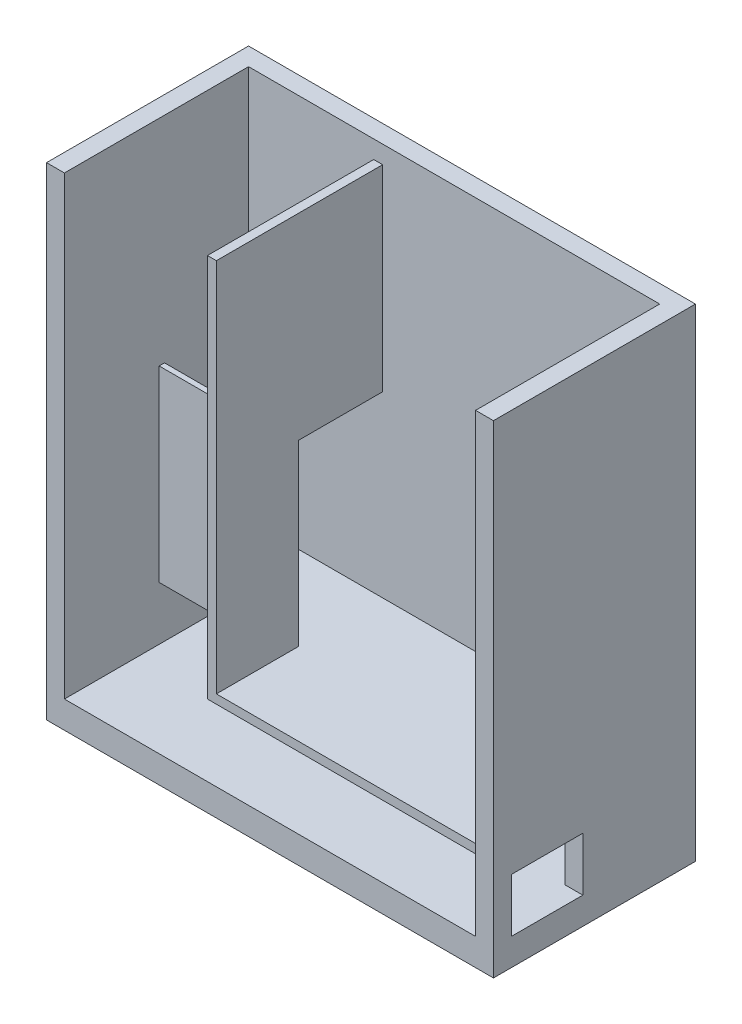
ISO-10303-21;
HEADER;
FILE_DESCRIPTION(('STEP AP214'),'2;1');
FILE_NAME('part.step','',(''),(''),'','','');
FILE_SCHEMA(('AUTOMOTIVE_DESIGN { 1 0 10303 214 1 1 1 1 }'));
ENDSEC;
DATA;
#1=APPLICATION_CONTEXT('core data for automotive mechanical design processes');
#2=APPLICATION_PROTOCOL_DEFINITION('international standard','automotive_design',2000,#1);
#3=PRODUCT_CONTEXT('',#1,'mechanical');
#4=PRODUCT('Part','Part','',(#3));
#5=PRODUCT_RELATED_PRODUCT_CATEGORY('part','',(#4));
#6=PRODUCT_DEFINITION_FORMATION('','',#4);
#7=PRODUCT_DEFINITION_CONTEXT('part definition',#1,'design');
#8=PRODUCT_DEFINITION('design','',#6,#7);
#9=PRODUCT_DEFINITION_SHAPE('','',#8);
#10=(LENGTH_UNIT() NAMED_UNIT(*) SI_UNIT(.MILLI.,.METRE.));
#11=(NAMED_UNIT(*) PLANE_ANGLE_UNIT() SI_UNIT($,.RADIAN.));
#12=(NAMED_UNIT(*) SI_UNIT($,.STERADIAN.) SOLID_ANGLE_UNIT());
#13=UNCERTAINTY_MEASURE_WITH_UNIT(LENGTH_MEASURE(1.E-05),#10,'distance_accuracy_value','');
#14=(GEOMETRIC_REPRESENTATION_CONTEXT(3) GLOBAL_UNCERTAINTY_ASSIGNED_CONTEXT((#13)) GLOBAL_UNIT_ASSIGNED_CONTEXT((#10,
#11,#12)) REPRESENTATION_CONTEXT('',''));
#15=CARTESIAN_POINT('',(0.,0.,0.));
#16=DIRECTION('',(0.,0.,1.));
#17=DIRECTION('',(1.,0.,0.));
#18=AXIS2_PLACEMENT_3D('',#15,#16,#17);
#19=CARTESIAN_POINT('',(120.,135.,56.5));
#20=DIRECTION('',(1.,0.,0.));
#21=DIRECTION('',(0.,1.,0.));
#22=AXIS2_PLACEMENT_3D('',#19,#20,#21);
#23=PLANE('',#22);
#24=DIRECTION('',(0.,0.,-1.));
#25=VECTOR('',#24,1.);
#26=CARTESIAN_POINT('',(120.,7.56999999999999,56.5));
#27=LINE('',#26,#25);
#28=CARTESIAN_POINT('',(120.,7.56999999999999,31.5));
#29=VERTEX_POINT('',#28);
#30=CARTESIAN_POINT('',(120.,7.56999999999999,5.));
#31=VERTEX_POINT('',#30);
#32=EDGE_CURVE('E364',#29,#31,#27,.T.);
#33=ORIENTED_EDGE('',*,*,#32,.F.);
#34=DIRECTION('',(0.,1.,0.));
#35=VECTOR('',#34,1.);
#36=CARTESIAN_POINT('',(120.,135.,31.5));
#37=LINE('',#36,#35);
#38=CARTESIAN_POINT('',(120.,22.57,31.5));
#39=VERTEX_POINT('',#38);
#40=EDGE_CURVE('E235',#29,#39,#37,.T.);
#41=ORIENTED_EDGE('',*,*,#40,.T.);
#42=DIRECTION('',(0.,0.,-1.));
#43=VECTOR('',#42,1.);
#44=CARTESIAN_POINT('',(120.,22.57,30.));
#45=LINE('',#44,#43);
#46=CARTESIAN_POINT('',(120.,22.57,5.));
#47=VERTEX_POINT('',#46);
#48=EDGE_CURVE('E316',#39,#47,#45,.T.);
#49=ORIENTED_EDGE('',*,*,#48,.T.);
#50=DIRECTION('',(0.,-1.,0.));
#51=VECTOR('',#50,1.);
#52=CARTESIAN_POINT('',(120.,135.,5.));
#53=LINE('',#52,#51);
#54=EDGE_CURVE('E363',#47,#31,#53,.T.);
#55=ORIENTED_EDGE('',*,*,#54,.T.);
#56=EDGE_LOOP('',(#33,#41,#49,#55));
#57=FACE_BOUND('',#56,.T.);
#58=ADVANCED_FACE('F40',(#57),#23,.F.);
#59=CARTESIAN_POINT('',(40.,130.,51.5));
#60=DIRECTION('',(0.,-1.,0.));
#61=DIRECTION('',(0.,0.,-1.));
#62=AXIS2_PLACEMENT_3D('',#59,#60,#61);
#63=PLANE('',#62);
#64=DIRECTION('',(-1.,0.,0.));
#65=VECTOR('',#64,1.);
#66=CARTESIAN_POINT('',(40.,130.,51.5));
#67=LINE('',#66,#65);
#68=CARTESIAN_POINT('',(42.5,130.,51.5));
#69=VERTEX_POINT('',#68);
#70=CARTESIAN_POINT('',(40.,130.,51.5));
#71=VERTEX_POINT('',#70);
#72=EDGE_CURVE('E253',#69,#71,#67,.T.);
#73=ORIENTED_EDGE('',*,*,#72,.F.);
#74=DIRECTION('',(0.,0.,-1.));
#75=VECTOR('',#74,1.);
#76=CARTESIAN_POINT('',(42.5,130.,51.5));
#77=LINE('',#76,#75);
#78=CARTESIAN_POINT('',(42.5,130.,5.));
#79=VERTEX_POINT('',#78);
#80=EDGE_CURVE('E341',#69,#79,#77,.T.);
#81=ORIENTED_EDGE('',*,*,#80,.T.);
#82=DIRECTION('',(-1.,0.,0.));
#83=VECTOR('',#82,1.);
#84=CARTESIAN_POINT('',(40.,130.,5.));
#85=LINE('',#84,#83);
#86=CARTESIAN_POINT('',(40.,130.,5.));
#87=VERTEX_POINT('',#86);
#88=EDGE_CURVE('E334',#79,#87,#85,.T.);
#89=ORIENTED_EDGE('',*,*,#88,.T.);
#90=DIRECTION('',(0.,0.,-1.));
#91=VECTOR('',#90,1.);
#92=CARTESIAN_POINT('',(40.,130.,51.5));
#93=LINE('',#92,#91);
#94=EDGE_CURVE('E338',#71,#87,#93,.T.);
#95=ORIENTED_EDGE('',*,*,#94,.F.);
#96=EDGE_LOOP('',(#73,#81,#89,#95));
#97=FACE_BOUND('',#96,.T.);
#98=ADVANCED_FACE('F506',(#97),#63,.F.);
#99=CARTESIAN_POINT('',(5.00000000000002,25.07,30.));
#100=DIRECTION('',(0.,-1.,0.));
#101=DIRECTION('',(0.,0.,-1.));
#102=AXIS2_PLACEMENT_3D('',#99,#100,#101);
#103=PLANE('',#102);
#104=DIRECTION('',(-1.,0.,0.));
#105=VECTOR('',#104,1.);
#106=CARTESIAN_POINT('',(5.00000000000001,25.07,51.5));
#107=LINE('',#106,#105);
#108=CARTESIAN_POINT('',(120.,25.07,51.5));
#109=VERTEX_POINT('',#108);
#110=CARTESIAN_POINT('',(42.5,25.07,51.5));
#111=VERTEX_POINT('',#110);
#112=EDGE_CURVE('E250',#109,#111,#107,.T.);
#113=ORIENTED_EDGE('',*,*,#112,.F.);
#114=DIRECTION('',(0.,0.,-1.));
#115=VECTOR('',#114,1.);
#116=CARTESIAN_POINT('',(120.,25.07,30.));
#117=LINE('',#116,#115);
#118=CARTESIAN_POINT('',(120.,25.07,5.));
#119=VERTEX_POINT('',#118);
#120=EDGE_CURVE('E313',#109,#119,#117,.T.);
#121=ORIENTED_EDGE('',*,*,#120,.T.);
#122=DIRECTION('',(-1.,0.,0.));
#123=VECTOR('',#122,1.);
#124=CARTESIAN_POINT('',(5.00000000000002,25.07,5.));
#125=LINE('',#124,#123);
#126=CARTESIAN_POINT('',(5.00000000000002,25.07,5.));
#127=VERTEX_POINT('',#126);
#128=EDGE_CURVE('E300',#119,#127,#125,.T.);
#129=ORIENTED_EDGE('',*,*,#128,.T.);
#130=DIRECTION('',(0.,0.,-1.));
#131=VECTOR('',#130,1.);
#132=CARTESIAN_POINT('',(5.00000000000002,25.07,30.));
#133=LINE('',#132,#131);
#134=CARTESIAN_POINT('',(5.00000000000002,25.07,28.5));
#135=VERTEX_POINT('',#134);
#136=EDGE_CURVE('E304',#135,#127,#133,.T.);
#137=ORIENTED_EDGE('',*,*,#136,.F.);
#138=DIRECTION('',(1.,0.,0.));
#139=VECTOR('',#138,1.);
#140=CARTESIAN_POINT('',(5.00000000000002,25.07,28.5));
#141=LINE('',#140,#139);
#142=CARTESIAN_POINT('',(42.5,25.07,28.5));
#143=VERTEX_POINT('',#142);
#144=EDGE_CURVE('E284',#135,#143,#141,.T.);
#145=ORIENTED_EDGE('',*,*,#144,.T.);
#146=DIRECTION('',(0.,0.,-1.));
#147=VECTOR('',#146,1.);
#148=CARTESIAN_POINT('',(42.5,25.07,56.5));
#149=LINE('',#148,#147);
#150=EDGE_CURVE('E270',#111,#143,#149,.T.);
#151=ORIENTED_EDGE('',*,*,#150,.F.);
#152=EDGE_LOOP('',(#113,#121,#129,#137,#145,#151));
#153=FACE_BOUND('',#152,.T.);
#154=ADVANCED_FACE('F493',(#153),#103,.F.);
#155=CARTESIAN_POINT('',(0.,0.,56.5));
#156=DIRECTION('',(0.,0.,1.));
#157=DIRECTION('',(1.,0.,0.));
#158=AXIS2_PLACEMENT_3D('',#155,#156,#157);
#159=PLANE('',#158);
#160=DIRECTION('',(0.,-1.,0.));
#161=VECTOR('',#160,1.);
#162=CARTESIAN_POINT('',(120.,135.,56.5));
#163=LINE('',#162,#161);
#164=CARTESIAN_POINT('',(120.,135.,56.5));
#165=VERTEX_POINT('',#164);
#166=CARTESIAN_POINT('',(120.,7.56999999999999,56.5));
#167=VERTEX_POINT('',#166);
#168=EDGE_CURVE('E376',#165,#167,#163,.T.);
#169=ORIENTED_EDGE('',*,*,#168,.T.);
#170=DIRECTION('',(1.,0.,0.));
#171=VECTOR('',#170,1.);
#172=CARTESIAN_POINT('',(5.00000000000002,7.57,56.5));
#173=LINE('',#172,#171);
#174=CARTESIAN_POINT('',(5.00000000000002,7.57,56.5));
#175=VERTEX_POINT('',#174);
#176=EDGE_CURVE('E351',#175,#167,#173,.T.);
#177=ORIENTED_EDGE('',*,*,#176,.F.);
#178=DIRECTION('',(0.,1.,0.));
#179=VECTOR('',#178,1.);
#180=CARTESIAN_POINT('',(5.,135.,56.5));
#181=LINE('',#180,#179);
#182=CARTESIAN_POINT('',(5.,135.,56.5));
#183=VERTEX_POINT('',#182);
#184=EDGE_CURVE('E394',#175,#183,#181,.T.);
#185=ORIENTED_EDGE('',*,*,#184,.T.);
#186=DIRECTION('',(-1.,0.,0.));
#187=VECTOR('',#186,1.);
#188=CARTESIAN_POINT('',(0.,135.,56.5));
#189=LINE('',#188,#187);
#190=CARTESIAN_POINT('',(0.,135.,56.5));
#191=VERTEX_POINT('',#190);
#192=EDGE_CURVE('E397',#183,#191,#189,.T.);
#193=ORIENTED_EDGE('',*,*,#192,.T.);
#194=DIRECTION('',(0.,-1.,0.));
#195=VECTOR('',#194,1.);
#196=CARTESIAN_POINT('',(0.,135.,56.5));
#197=LINE('',#196,#195);
#198=CARTESIAN_POINT('',(0.,0.,56.5));
#199=VERTEX_POINT('',#198);
#200=EDGE_CURVE('E386',#191,#199,#197,.T.);
#201=ORIENTED_EDGE('',*,*,#200,.T.);
#202=DIRECTION('',(1.,0.,0.));
#203=VECTOR('',#202,1.);
#204=CARTESIAN_POINT('',(0.,0.,56.5));
#205=LINE('',#204,#203);
#206=CARTESIAN_POINT('',(125.,0.,56.5));
#207=VERTEX_POINT('',#206);
#208=EDGE_CURVE('E390',#199,#207,#205,.T.);
#209=ORIENTED_EDGE('',*,*,#208,.T.);
#210=DIRECTION('',(0.,1.,0.));
#211=VECTOR('',#210,1.);
#212=CARTESIAN_POINT('',(125.,135.,56.5));
#213=LINE('',#212,#211);
#214=CARTESIAN_POINT('',(125.,135.,56.5));
#215=VERTEX_POINT('',#214);
#216=EDGE_CURVE('E368',#207,#215,#213,.T.);
#217=ORIENTED_EDGE('',*,*,#216,.T.);
#218=DIRECTION('',(-1.,0.,0.));
#219=VECTOR('',#218,1.);
#220=CARTESIAN_POINT('',(125.,135.,56.5));
#221=LINE('',#220,#219);
#222=EDGE_CURVE('E372',#215,#165,#221,.T.);
#223=ORIENTED_EDGE('',*,*,#222,.T.);
#224=EDGE_LOOP('',(#169,#177,#185,#193,#201,#209,#217,#223));
#225=FACE_BOUND('',#224,.T.);
#226=ADVANCED_FACE('F451',(#225),#159,.T.);
#227=CARTESIAN_POINT('',(40.,130.,51.5));
#228=DIRECTION('',(1.,0.,0.));
#229=DIRECTION('',(0.,0.,-1.));
#230=AXIS2_PLACEMENT_3D('',#227,#228,#229);
#231=PLANE('',#230);
#232=DIRECTION('',(0.,-1.,0.));
#233=VECTOR('',#232,1.);
#234=CARTESIAN_POINT('',(40.,135.,51.5));
#235=LINE('',#234,#233);
#236=CARTESIAN_POINT('',(40.,22.57,51.5));
#237=VERTEX_POINT('',#236);
#238=EDGE_CURVE('E241',#71,#237,#235,.T.);
#239=ORIENTED_EDGE('',*,*,#238,.F.);
#240=ORIENTED_EDGE('',*,*,#94,.T.);
#241=DIRECTION('',(0.,-1.,0.));
#242=VECTOR('',#241,1.);
#243=CARTESIAN_POINT('',(40.,130.,5.));
#244=LINE('',#243,#242);
#245=CARTESIAN_POINT('',(40.,75.,5.));
#246=VERTEX_POINT('',#245);
#247=EDGE_CURVE('E322',#87,#246,#244,.T.);
#248=ORIENTED_EDGE('',*,*,#247,.T.);
#249=DIRECTION('',(0.,0.,-1.));
#250=VECTOR('',#249,1.);
#251=CARTESIAN_POINT('',(40.,75.,51.5));
#252=LINE('',#251,#250);
#253=CARTESIAN_POINT('',(40.,75.,28.5));
#254=VERTEX_POINT('',#253);
#255=EDGE_CURVE('E347',#254,#246,#252,.T.);
#256=ORIENTED_EDGE('',*,*,#255,.F.);
#257=DIRECTION('',(0.,0.,1.));
#258=VECTOR('',#257,1.);
#259=CARTESIAN_POINT('',(40.,75.,-0.001000000000001));
#260=LINE('',#259,#258);
#261=CARTESIAN_POINT('',(40.,75.,30.));
#262=VERTEX_POINT('',#261);
#263=EDGE_CURVE('E261',#254,#262,#260,.T.);
#264=ORIENTED_EDGE('',*,*,#263,.T.);
#265=DIRECTION('',(0.,-1.,0.));
#266=VECTOR('',#265,1.);
#267=CARTESIAN_POINT('',(40.,165.032128111207,30.));
#268=LINE('',#267,#266);
#269=CARTESIAN_POINT('',(40.,22.57,30.));
#270=VERTEX_POINT('',#269);
#271=EDGE_CURVE('E291',#262,#270,#268,.T.);
#272=ORIENTED_EDGE('',*,*,#271,.T.);
#273=DIRECTION('',(0.,0.,-1.));
#274=VECTOR('',#273,1.);
#275=CARTESIAN_POINT('',(40.,22.57,136.539052967911));
#276=LINE('',#275,#274);
#277=EDGE_CURVE('E281',#237,#270,#276,.T.);
#278=ORIENTED_EDGE('',*,*,#277,.F.);
#279=EDGE_LOOP('',(#239,#240,#248,#256,#264,#272,#278));
#280=FACE_BOUND('',#279,.T.);
#281=ADVANCED_FACE('F512',(#280),#231,.F.);
#282=CARTESIAN_POINT('',(42.5,130.,51.5));
#283=DIRECTION('',(-1.,0.,0.));
#284=DIRECTION('',(0.,-1.,0.));
#285=AXIS2_PLACEMENT_3D('',#282,#283,#284);
#286=PLANE('',#285);
#287=DIRECTION('',(0.,1.,0.));
#288=VECTOR('',#287,1.);
#289=CARTESIAN_POINT('',(42.5,130.,51.5));
#290=LINE('',#289,#288);
#291=EDGE_CURVE('E247',#111,#69,#290,.T.);
#292=ORIENTED_EDGE('',*,*,#291,.F.);
#293=ORIENTED_EDGE('',*,*,#150,.T.);
#294=DIRECTION('',(0.,-1.,0.));
#295=VECTOR('',#294,1.);
#296=CARTESIAN_POINT('',(42.5,158.111385593741,28.5));
#297=LINE('',#296,#295);
#298=CARTESIAN_POINT('',(42.5,75.,28.5));
#299=VERTEX_POINT('',#298);
#300=EDGE_CURVE('E273',#299,#143,#297,.T.);
#301=ORIENTED_EDGE('',*,*,#300,.F.);
#302=DIRECTION('',(0.,0.,-1.));
#303=VECTOR('',#302,1.);
#304=CARTESIAN_POINT('',(42.5,75.,51.5));
#305=LINE('',#304,#303);
#306=CARTESIAN_POINT('',(42.5,75.,5.));
#307=VERTEX_POINT('',#306);
#308=EDGE_CURVE('E344',#299,#307,#305,.T.);
#309=ORIENTED_EDGE('',*,*,#308,.T.);
#310=DIRECTION('',(0.,1.,0.));
#311=VECTOR('',#310,1.);
#312=CARTESIAN_POINT('',(42.5,130.,5.));
#313=LINE('',#312,#311);
#314=EDGE_CURVE('E330',#307,#79,#313,.T.);
#315=ORIENTED_EDGE('',*,*,#314,.T.);
#316=ORIENTED_EDGE('',*,*,#80,.F.);
#317=EDGE_LOOP('',(#292,#293,#301,#309,#315,#316));
#318=FACE_BOUND('',#317,.T.);
#319=ADVANCED_FACE('F501',(#318),#286,.F.);
#320=CARTESIAN_POINT('',(5.00000000000002,22.57,30.));
#321=DIRECTION('',(0.,1.,0.));
#322=DIRECTION('',(-1.,0.,0.));
#323=AXIS2_PLACEMENT_3D('',#320,#321,#322);
#324=PLANE('',#323);
#325=ORIENTED_EDGE('',*,*,#48,.F.);
#326=DIRECTION('',(1.,0.,0.));
#327=VECTOR('',#326,1.);
#328=CARTESIAN_POINT('',(117.5,22.57,31.5));
#329=LINE('',#328,#327);
#330=CARTESIAN_POINT('',(125.,22.57,31.5));
#331=VERTEX_POINT('',#330);
#332=EDGE_CURVE('E207',#39,#331,#329,.T.);
#333=ORIENTED_EDGE('',*,*,#332,.T.);
#334=DIRECTION('',(0.,0.,1.));
#335=VECTOR('',#334,1.);
#336=CARTESIAN_POINT('',(125.,22.57,31.5));
#337=LINE('',#336,#335);
#338=CARTESIAN_POINT('',(125.,22.57,51.5));
#339=VERTEX_POINT('',#338);
#340=EDGE_CURVE('E210',#331,#339,#337,.T.);
#341=ORIENTED_EDGE('',*,*,#340,.T.);
#342=DIRECTION('',(1.,0.,0.));
#343=VECTOR('',#342,1.);
#344=CARTESIAN_POINT('',(117.5,22.57,51.5));
#345=LINE('',#344,#343);
#346=CARTESIAN_POINT('',(120.,22.57,51.5));
#347=VERTEX_POINT('',#346);
#348=EDGE_CURVE('E196',#347,#339,#345,.T.);
#349=ORIENTED_EDGE('',*,*,#348,.F.);
#350=DIRECTION('',(-1.,0.,0.));
#351=VECTOR('',#350,1.);
#352=CARTESIAN_POINT('',(120.,22.57,51.5));
#353=LINE('',#352,#351);
#354=EDGE_CURVE('E64',#347,#237,#353,.T.);
#355=ORIENTED_EDGE('',*,*,#354,.T.);
#356=ORIENTED_EDGE('',*,*,#277,.T.);
#357=DIRECTION('',(1.,0.,0.));
#358=VECTOR('',#357,1.);
#359=CARTESIAN_POINT('',(5.00000000000002,22.57,30.));
#360=LINE('',#359,#358);
#361=CARTESIAN_POINT('',(5.00000000000002,22.57,30.));
#362=VERTEX_POINT('',#361);
#363=EDGE_CURVE('E299',#362,#270,#360,.T.);
#364=ORIENTED_EDGE('',*,*,#363,.F.);
#365=DIRECTION('',(0.,0.,-1.));
#366=VECTOR('',#365,1.);
#367=CARTESIAN_POINT('',(5.00000000000002,22.57,30.));
#368=LINE('',#367,#366);
#369=CARTESIAN_POINT('',(5.00000000000002,22.57,5.));
#370=VERTEX_POINT('',#369);
#371=EDGE_CURVE('E319',#362,#370,#368,.T.);
#372=ORIENTED_EDGE('',*,*,#371,.T.);
#373=DIRECTION('',(1.,0.,0.));
#374=VECTOR('',#373,1.);
#375=CARTESIAN_POINT('',(5.00000000000002,22.57,5.));
#376=LINE('',#375,#374);
#377=EDGE_CURVE('E295',#370,#47,#376,.T.);
#378=ORIENTED_EDGE('',*,*,#377,.T.);
#379=EDGE_LOOP('',(#325,#333,#341,#349,#355,#356,#364,#372,#378));
#380=FACE_BOUND('',#379,.T.);
#381=ADVANCED_FACE('F212',(#380),#324,.F.);
#382=DIRECTION('',(0.,-1.,0.));
#383=VECTOR('',#382,1.);
#384=CARTESIAN_POINT('',(120.,135.,51.5));
#385=LINE('',#384,#383);
#386=EDGE_CURVE('E244',#109,#347,#385,.T.);
#387=ORIENTED_EDGE('',*,*,#386,.T.);
#388=DIRECTION('',(0.,-1.,0.));
#389=VECTOR('',#388,1.);
#390=CARTESIAN_POINT('',(120.,135.,51.5));
#391=LINE('',#390,#389);
#392=CARTESIAN_POINT('',(120.,7.56999999999999,51.5));
#393=VERTEX_POINT('',#392);
#394=EDGE_CURVE('E203',#347,#393,#391,.T.);
#395=ORIENTED_EDGE('',*,*,#394,.T.);
#396=EDGE_CURVE('E359',#167,#393,#27,.T.);
#397=ORIENTED_EDGE('',*,*,#396,.F.);
#398=ORIENTED_EDGE('',*,*,#168,.F.);
#399=DIRECTION('',(0.,0.,-1.));
#400=VECTOR('',#399,1.);
#401=CARTESIAN_POINT('',(120.,135.,56.5));
#402=LINE('',#401,#400);
#403=CARTESIAN_POINT('',(120.,135.,5.));
#404=VERTEX_POINT('',#403);
#405=EDGE_CURVE('E379',#165,#404,#402,.T.);
#406=ORIENTED_EDGE('',*,*,#405,.T.);
#407=EDGE_CURVE('E373',#404,#119,#53,.T.);
#408=ORIENTED_EDGE('',*,*,#407,.T.);
#409=ORIENTED_EDGE('',*,*,#120,.F.);
#410=EDGE_LOOP('',(#387,#395,#397,#398,#406,#408,#409));
#411=FACE_BOUND('',#410,.T.);
#412=ADVANCED_FACE('F467',(#411),#23,.F.);
#413=CARTESIAN_POINT('',(0.,0.,30.));
#414=DIRECTION('',(0.,0.,1.));
#415=DIRECTION('',(1.,0.,0.));
#416=AXIS2_PLACEMENT_3D('',#413,#414,#415);
#417=PLANE('',#416);
#418=DIRECTION('',(1.,0.,0.));
#419=VECTOR('',#418,1.);
#420=CARTESIAN_POINT('',(5.00000000000002,75.,30.));
#421=LINE('',#420,#419);
#422=CARTESIAN_POINT('',(5.00000000000002,75.,30.));
#423=VERTEX_POINT('',#422);
#424=EDGE_CURVE('E256',#423,#262,#421,.T.);
#425=ORIENTED_EDGE('',*,*,#424,.F.);
#426=DIRECTION('',(0.,-1.,0.));
#427=VECTOR('',#426,1.);
#428=CARTESIAN_POINT('',(5.00000000000002,25.07,30.));
#429=LINE('',#428,#427);
#430=EDGE_CURVE('E296',#423,#362,#429,.T.);
#431=ORIENTED_EDGE('',*,*,#430,.T.);
#432=ORIENTED_EDGE('',*,*,#363,.T.);
#433=ORIENTED_EDGE('',*,*,#271,.F.);
#434=EDGE_LOOP('',(#425,#431,#432,#433));
#435=FACE_BOUND('',#434,.T.);
#436=ADVANCED_FACE('F482',(#435),#417,.T.);
#437=CARTESIAN_POINT('',(5.,135.,56.5));
#438=DIRECTION('',(-1.,0.,0.));
#439=DIRECTION('',(0.,-1.,0.));
#440=AXIS2_PLACEMENT_3D('',#437,#438,#439);
#441=PLANE('',#440);
#442=ORIENTED_EDGE('',*,*,#430,.F.);
#443=DIRECTION('',(0.,0.,1.));
#444=VECTOR('',#443,1.);
#445=CARTESIAN_POINT('',(5.00000000000002,75.,-0.001000000000001));
#446=LINE('',#445,#444);
#447=CARTESIAN_POINT('',(5.00000000000002,75.,28.5));
#448=VERTEX_POINT('',#447);
#449=EDGE_CURVE('E267',#448,#423,#446,.T.);
#450=ORIENTED_EDGE('',*,*,#449,.F.);
#451=DIRECTION('',(0.,-1.,0.));
#452=VECTOR('',#451,1.);
#453=CARTESIAN_POINT('',(5.00000000000002,165.032128111207,28.5));
#454=LINE('',#453,#452);
#455=EDGE_CURVE('E288',#448,#135,#454,.T.);
#456=ORIENTED_EDGE('',*,*,#455,.T.);
#457=ORIENTED_EDGE('',*,*,#136,.T.);
#458=DIRECTION('',(0.,1.,0.));
#459=VECTOR('',#458,1.);
#460=CARTESIAN_POINT('',(5.,135.,5.));
#461=LINE('',#460,#459);
#462=CARTESIAN_POINT('',(5.,135.,5.));
#463=VERTEX_POINT('',#462);
#464=EDGE_CURVE('E385',#127,#463,#461,.T.);
#465=ORIENTED_EDGE('',*,*,#464,.T.);
#466=DIRECTION('',(0.,0.,-1.));
#467=VECTOR('',#466,1.);
#468=CARTESIAN_POINT('',(5.,135.,56.5));
#469=LINE('',#468,#467);
#470=EDGE_CURVE('E401',#183,#463,#469,.T.);
#471=ORIENTED_EDGE('',*,*,#470,.F.);
#472=ORIENTED_EDGE('',*,*,#184,.F.);
#473=DIRECTION('',(0.,0.,-1.));
#474=VECTOR('',#473,1.);
#475=CARTESIAN_POINT('',(5.00000000000002,7.57,56.5));
#476=LINE('',#475,#474);
#477=CARTESIAN_POINT('',(5.00000000000002,7.57,5.));
#478=VERTEX_POINT('',#477);
#479=EDGE_CURVE('E355',#175,#478,#476,.T.);
#480=ORIENTED_EDGE('',*,*,#479,.T.);
#481=EDGE_CURVE('E391',#478,#370,#461,.T.);
#482=ORIENTED_EDGE('',*,*,#481,.T.);
#483=ORIENTED_EDGE('',*,*,#371,.F.);
#484=EDGE_LOOP('',(#442,#450,#456,#457,#465,#471,#472,#480,#482,#483));
#485=FACE_BOUND('',#484,.T.);
#486=ADVANCED_FACE('F457',(#485),#441,.F.);
#487=CARTESIAN_POINT('',(0.,0.,5.));
#488=DIRECTION('',(0.,0.,1.));
#489=DIRECTION('',(1.,0.,0.));
#490=AXIS2_PLACEMENT_3D('',#487,#488,#489);
#491=PLANE('',#490);
#492=ORIENTED_EDGE('',*,*,#54,.F.);
#493=ORIENTED_EDGE('',*,*,#377,.F.);
#494=ORIENTED_EDGE('',*,*,#481,.F.);
#495=DIRECTION('',(1.,0.,0.));
#496=VECTOR('',#495,1.);
#497=CARTESIAN_POINT('',(5.00000000000002,7.57,5.));
#498=LINE('',#497,#496);
#499=EDGE_CURVE('E350',#478,#31,#498,.T.);
#500=ORIENTED_EDGE('',*,*,#499,.T.);
#501=EDGE_LOOP('',(#492,#493,#494,#500));
#502=FACE_BOUND('',#501,.T.);
#503=ADVANCED_FACE('F476',(#502),#491,.T.);
#504=DIRECTION('',(1.,0.,0.));
#505=VECTOR('',#504,1.);
#506=CARTESIAN_POINT('',(40.,75.,5.));
#507=LINE('',#506,#505);
#508=EDGE_CURVE('E326',#246,#307,#507,.T.);
#509=ORIENTED_EDGE('',*,*,#508,.F.);
#510=ORIENTED_EDGE('',*,*,#247,.F.);
#511=ORIENTED_EDGE('',*,*,#88,.F.);
#512=ORIENTED_EDGE('',*,*,#314,.F.);
#513=EDGE_LOOP('',(#509,#510,#511,#512));
#514=FACE_BOUND('',#513,.T.);
#515=ORIENTED_EDGE('',*,*,#464,.F.);
#516=ORIENTED_EDGE('',*,*,#128,.F.);
#517=ORIENTED_EDGE('',*,*,#407,.F.);
#518=DIRECTION('',(1.,0.,0.));
#519=VECTOR('',#518,1.);
#520=CARTESIAN_POINT('',(0.,135.,5.));
#521=LINE('',#520,#519);
#522=EDGE_CURVE('E409',#463,#404,#521,.T.);
#523=ORIENTED_EDGE('',*,*,#522,.F.);
#524=EDGE_LOOP('',(#515,#516,#517,#523));
#525=FACE_BOUND('',#524,.T.);
#526=ADVANCED_FACE('F463',(#514,#525),#491,.T.);
#527=CARTESIAN_POINT('',(0.,0.,5.));
#528=DIRECTION('',(0.,1.,0.));
#529=DIRECTION('',(0.,0.,1.));
#530=AXIS2_PLACEMENT_3D('',#527,#528,#529);
#531=PLANE('',#530);
#532=DIRECTION('',(1.,0.,0.));
#533=VECTOR('',#532,1.);
#534=CARTESIAN_POINT('',(0.,0.,0.));
#535=LINE('',#534,#533);
#536=CARTESIAN_POINT('',(0.,0.,0.));
#537=VERTEX_POINT('',#536);
#538=CARTESIAN_POINT('',(125.,0.,0.));
#539=VERTEX_POINT('',#538);
#540=EDGE_CURVE('E408',#537,#539,#535,.T.);
#541=ORIENTED_EDGE('',*,*,#540,.T.);
#542=DIRECTION('',(0.,0.,-1.));
#543=VECTOR('',#542,1.);
#544=CARTESIAN_POINT('',(125.,0.,5.));
#545=LINE('',#544,#543);
#546=EDGE_CURVE('E11',#207,#539,#545,.T.);
#547=ORIENTED_EDGE('',*,*,#546,.F.);
#548=ORIENTED_EDGE('',*,*,#208,.F.);
#549=DIRECTION('',(0.,0.,-1.));
#550=VECTOR('',#549,1.);
#551=CARTESIAN_POINT('',(0.,0.,5.));
#552=LINE('',#551,#550);
#553=EDGE_CURVE('E413',#199,#537,#552,.T.);
#554=ORIENTED_EDGE('',*,*,#553,.T.);
#555=EDGE_LOOP('',(#541,#547,#548,#554));
#556=FACE_BOUND('',#555,.T.);
#557=ADVANCED_FACE('F42',(#556),#531,.F.);
#558=CARTESIAN_POINT('',(125.,0.,5.));
#559=DIRECTION('',(-1.,0.,0.));
#560=DIRECTION('',(0.,0.,1.));
#561=AXIS2_PLACEMENT_3D('',#558,#559,#560);
#562=PLANE('',#561);
#563=ORIENTED_EDGE('',*,*,#340,.F.);
#564=DIRECTION('',(0.,1.,0.));
#565=VECTOR('',#564,1.);
#566=CARTESIAN_POINT('',(125.,7.56999999999999,31.5));
#567=LINE('',#566,#565);
#568=CARTESIAN_POINT('',(125.,7.56999999999999,31.5));
#569=VERTEX_POINT('',#568);
#570=EDGE_CURVE('E56',#569,#331,#567,.T.);
#571=ORIENTED_EDGE('',*,*,#570,.F.);
#572=DIRECTION('',(0.,0.,-1.));
#573=VECTOR('',#572,1.);
#574=CARTESIAN_POINT('',(125.,7.56999999999999,31.5));
#575=LINE('',#574,#573);
#576=CARTESIAN_POINT('',(125.,7.56999999999999,51.5));
#577=VERTEX_POINT('',#576);
#578=EDGE_CURVE('E219',#577,#569,#575,.T.);
#579=ORIENTED_EDGE('',*,*,#578,.F.);
#580=DIRECTION('',(0.,-1.,0.));
#581=VECTOR('',#580,1.);
#582=CARTESIAN_POINT('',(125.,7.56999999999999,51.5));
#583=LINE('',#582,#581);
#584=EDGE_CURVE('E200',#339,#577,#583,.T.);
#585=ORIENTED_EDGE('',*,*,#584,.F.);
#586=EDGE_LOOP('',(#563,#571,#579,#585));
#587=FACE_BOUND('',#586,.T.);
#588=DIRECTION('',(0.,1.,0.));
#589=VECTOR('',#588,1.);
#590=CARTESIAN_POINT('',(125.,0.,0.));
#591=LINE('',#590,#589);
#592=CARTESIAN_POINT('',(125.,135.,0.));
#593=VERTEX_POINT('',#592);
#594=EDGE_CURVE('E418',#539,#593,#591,.T.);
#595=ORIENTED_EDGE('',*,*,#594,.T.);
#596=DIRECTION('',(0.,0.,-1.));
#597=VECTOR('',#596,1.);
#598=CARTESIAN_POINT('',(125.,135.,5.));
#599=LINE('',#598,#597);
#600=EDGE_CURVE('E49',#215,#593,#599,.T.);
#601=ORIENTED_EDGE('',*,*,#600,.F.);
#602=ORIENTED_EDGE('',*,*,#216,.F.);
#603=ORIENTED_EDGE('',*,*,#546,.T.);
#604=EDGE_LOOP('',(#595,#601,#602,#603));
#605=FACE_BOUND('',#604,.T.);
#606=ADVANCED_FACE('F216',(#587,#605),#562,.F.);
#607=CARTESIAN_POINT('',(0.,135.,5.));
#608=DIRECTION('',(0.,1.,0.));
#609=DIRECTION('',(0.,0.,1.));
#610=AXIS2_PLACEMENT_3D('',#607,#608,#609);
#611=PLANE('',#610);
#612=DIRECTION('',(1.,0.,0.));
#613=VECTOR('',#612,1.);
#614=CARTESIAN_POINT('',(0.,135.,0.));
#615=LINE('',#614,#613);
#616=CARTESIAN_POINT('',(0.,135.,0.));
#617=VERTEX_POINT('',#616);
#618=EDGE_CURVE('E422',#617,#593,#615,.T.);
#619=ORIENTED_EDGE('',*,*,#618,.F.);
#620=DIRECTION('',(0.,0.,-1.));
#621=VECTOR('',#620,1.);
#622=CARTESIAN_POINT('',(0.,135.,5.));
#623=LINE('',#622,#621);
#624=EDGE_CURVE('E431',#191,#617,#623,.T.);
#625=ORIENTED_EDGE('',*,*,#624,.F.);
#626=ORIENTED_EDGE('',*,*,#192,.F.);
#627=ORIENTED_EDGE('',*,*,#470,.T.);
#628=ORIENTED_EDGE('',*,*,#522,.T.);
#629=ORIENTED_EDGE('',*,*,#405,.F.);
#630=ORIENTED_EDGE('',*,*,#222,.F.);
#631=ORIENTED_EDGE('',*,*,#600,.T.);
#632=EDGE_LOOP('',(#619,#625,#626,#627,#628,#629,#630,#631));
#633=FACE_BOUND('',#632,.T.);
#634=ADVANCED_FACE('F437',(#633),#611,.T.);
#635=CARTESIAN_POINT('',(0.,0.,5.));
#636=DIRECTION('',(-1.,0.,0.));
#637=DIRECTION('',(0.,0.,1.));
#638=AXIS2_PLACEMENT_3D('',#635,#636,#637);
#639=PLANE('',#638);
#640=DIRECTION('',(0.,1.,0.));
#641=VECTOR('',#640,1.);
#642=CARTESIAN_POINT('',(0.,0.,0.));
#643=LINE('',#642,#641);
#644=EDGE_CURVE('E414',#537,#617,#643,.T.);
#645=ORIENTED_EDGE('',*,*,#644,.F.);
#646=ORIENTED_EDGE('',*,*,#553,.F.);
#647=ORIENTED_EDGE('',*,*,#200,.F.);
#648=ORIENTED_EDGE('',*,*,#624,.T.);
#649=EDGE_LOOP('',(#645,#646,#647,#648));
#650=FACE_BOUND('',#649,.T.);
#651=ADVANCED_FACE('F446',(#650),#639,.T.);
#652=CARTESIAN_POINT('',(0.,0.,0.));
#653=DIRECTION('',(0.,0.,1.));
#654=DIRECTION('',(1.,0.,0.));
#655=AXIS2_PLACEMENT_3D('',#652,#653,#654);
#656=PLANE('',#655);
#657=ORIENTED_EDGE('',*,*,#540,.F.);
#658=ORIENTED_EDGE('',*,*,#644,.T.);
#659=ORIENTED_EDGE('',*,*,#618,.T.);
#660=ORIENTED_EDGE('',*,*,#594,.F.);
#661=EDGE_LOOP('',(#657,#658,#659,#660));
#662=FACE_BOUND('',#661,.T.);
#663=ADVANCED_FACE('F443',(#662),#656,.F.);
#664=CARTESIAN_POINT('',(5.00000000000002,7.57,56.5));
#665=DIRECTION('',(0.,1.,0.));
#666=DIRECTION('',(-1.,0.,0.));
#667=AXIS2_PLACEMENT_3D('',#664,#665,#666);
#668=PLANE('',#667);
#669=ORIENTED_EDGE('',*,*,#396,.T.);
#670=DIRECTION('',(1.,0.,0.));
#671=VECTOR('',#670,1.);
#672=CARTESIAN_POINT('',(117.5,7.56999999999999,51.5));
#673=LINE('',#672,#671);
#674=EDGE_CURVE('E206',#393,#577,#673,.T.);
#675=ORIENTED_EDGE('',*,*,#674,.T.);
#676=ORIENTED_EDGE('',*,*,#578,.T.);
#677=DIRECTION('',(1.,0.,0.));
#678=VECTOR('',#677,1.);
#679=CARTESIAN_POINT('',(117.5,7.56999999999999,31.5));
#680=LINE('',#679,#678);
#681=EDGE_CURVE('E226',#29,#569,#680,.T.);
#682=ORIENTED_EDGE('',*,*,#681,.F.);
#683=ORIENTED_EDGE('',*,*,#32,.T.);
#684=ORIENTED_EDGE('',*,*,#499,.F.);
#685=ORIENTED_EDGE('',*,*,#479,.F.);
#686=ORIENTED_EDGE('',*,*,#176,.T.);
#687=EDGE_LOOP('',(#669,#675,#676,#682,#683,#684,#685,#686));
#688=FACE_BOUND('',#687,.T.);
#689=ADVANCED_FACE('F470',(#688),#668,.T.);
#690=CARTESIAN_POINT('',(40.,75.,51.5));
#691=DIRECTION('',(0.,1.,0.));
#692=DIRECTION('',(0.,0.,1.));
#693=AXIS2_PLACEMENT_3D('',#690,#691,#692);
#694=PLANE('',#693);
#695=ORIENTED_EDGE('',*,*,#308,.F.);
#696=DIRECTION('',(-1.,0.,0.));
#697=VECTOR('',#696,1.);
#698=CARTESIAN_POINT('',(40.,75.,28.5));
#699=LINE('',#698,#697);
#700=EDGE_CURVE('E277',#299,#254,#699,.T.);
#701=ORIENTED_EDGE('',*,*,#700,.T.);
#702=ORIENTED_EDGE('',*,*,#255,.T.);
#703=ORIENTED_EDGE('',*,*,#508,.T.);
#704=EDGE_LOOP('',(#695,#701,#702,#703));
#705=FACE_BOUND('',#704,.T.);
#706=ADVANCED_FACE('F517',(#705),#694,.F.);
#707=CARTESIAN_POINT('',(5.00000000000002,165.032128111207,28.5));
#708=DIRECTION('',(0.,0.,-1.));
#709=DIRECTION('',(-1.,0.,0.));
#710=AXIS2_PLACEMENT_3D('',#707,#708,#709);
#711=PLANE('',#710);
#712=DIRECTION('',(1.,0.,0.));
#713=VECTOR('',#712,1.);
#714=CARTESIAN_POINT('',(5.00000000000002,75.,28.5));
#715=LINE('',#714,#713);
#716=EDGE_CURVE('E257',#448,#254,#715,.T.);
#717=ORIENTED_EDGE('',*,*,#716,.T.);
#718=ORIENTED_EDGE('',*,*,#700,.F.);
#719=ORIENTED_EDGE('',*,*,#300,.T.);
#720=ORIENTED_EDGE('',*,*,#144,.F.);
#721=ORIENTED_EDGE('',*,*,#455,.F.);
#722=EDGE_LOOP('',(#717,#718,#719,#720,#721));
#723=FACE_BOUND('',#722,.T.);
#724=ADVANCED_FACE('F489',(#723),#711,.T.);
#725=CARTESIAN_POINT('',(5.00000000000002,75.,-0.001000000000001));
#726=DIRECTION('',(0.,-1.,0.));
#727=DIRECTION('',(0.,0.,-1.));
#728=AXIS2_PLACEMENT_3D('',#725,#726,#727);
#729=PLANE('',#728);
#730=ORIENTED_EDGE('',*,*,#449,.T.);
#731=ORIENTED_EDGE('',*,*,#424,.T.);
#732=ORIENTED_EDGE('',*,*,#263,.F.);
#733=ORIENTED_EDGE('',*,*,#716,.F.);
#734=EDGE_LOOP('',(#730,#731,#732,#733));
#735=FACE_BOUND('',#734,.T.);
#736=ADVANCED_FACE('F485',(#735),#729,.F.);
#737=CARTESIAN_POINT('',(120.,135.,51.5));
#738=DIRECTION('',(0.,0.,1.));
#739=DIRECTION('',(1.,0.,0.));
#740=AXIS2_PLACEMENT_3D('',#737,#738,#739);
#741=PLANE('',#740);
#742=ORIENTED_EDGE('',*,*,#72,.T.);
#743=ORIENTED_EDGE('',*,*,#238,.T.);
#744=ORIENTED_EDGE('',*,*,#354,.F.);
#745=ORIENTED_EDGE('',*,*,#386,.F.);
#746=ORIENTED_EDGE('',*,*,#112,.T.);
#747=ORIENTED_EDGE('',*,*,#291,.T.);
#748=EDGE_LOOP('',(#742,#743,#744,#745,#746,#747));
#749=FACE_BOUND('',#748,.T.);
#750=ADVANCED_FACE('F497',(#749),#741,.T.);
#751=CARTESIAN_POINT('',(117.5,7.56999999999999,31.5));
#752=DIRECTION('',(0.,0.,-1.));
#753=DIRECTION('',(-1.,0.,0.));
#754=AXIS2_PLACEMENT_3D('',#751,#752,#753);
#755=PLANE('',#754);
#756=ORIENTED_EDGE('',*,*,#681,.T.);
#757=ORIENTED_EDGE('',*,*,#570,.T.);
#758=ORIENTED_EDGE('',*,*,#332,.F.);
#759=ORIENTED_EDGE('',*,*,#40,.F.);
#760=EDGE_LOOP('',(#756,#757,#758,#759));
#761=FACE_BOUND('',#760,.T.);
#762=ADVANCED_FACE('F593',(#761),#755,.F.);
#763=CARTESIAN_POINT('',(117.5,7.56999999999999,51.5));
#764=DIRECTION('',(0.,0.,1.));
#765=DIRECTION('',(1.,0.,0.));
#766=AXIS2_PLACEMENT_3D('',#763,#764,#765);
#767=PLANE('',#766);
#768=ORIENTED_EDGE('',*,*,#348,.T.);
#769=ORIENTED_EDGE('',*,*,#584,.T.);
#770=ORIENTED_EDGE('',*,*,#674,.F.);
#771=ORIENTED_EDGE('',*,*,#394,.F.);
#772=EDGE_LOOP('',(#768,#769,#770,#771));
#773=FACE_BOUND('',#772,.T.);
#774=ADVANCED_FACE('F198',(#773),#767,.F.);
#775=CLOSED_SHELL('',(#58,#98,#154,#226,#281,#319,#381,#412,#436,#486,#503,#526,#557,#606,#634,
#651,#663,#689,#706,#724,#736,#750,#762,#774));
#776=MANIFOLD_SOLID_BREP('B2',#775);
#777=ADVANCED_BREP_SHAPE_REPRESENTATION('',(#18,#776),#14);
#778=SHAPE_DEFINITION_REPRESENTATION(#9,#777);
ENDSEC;
END-ISO-10303-21;
